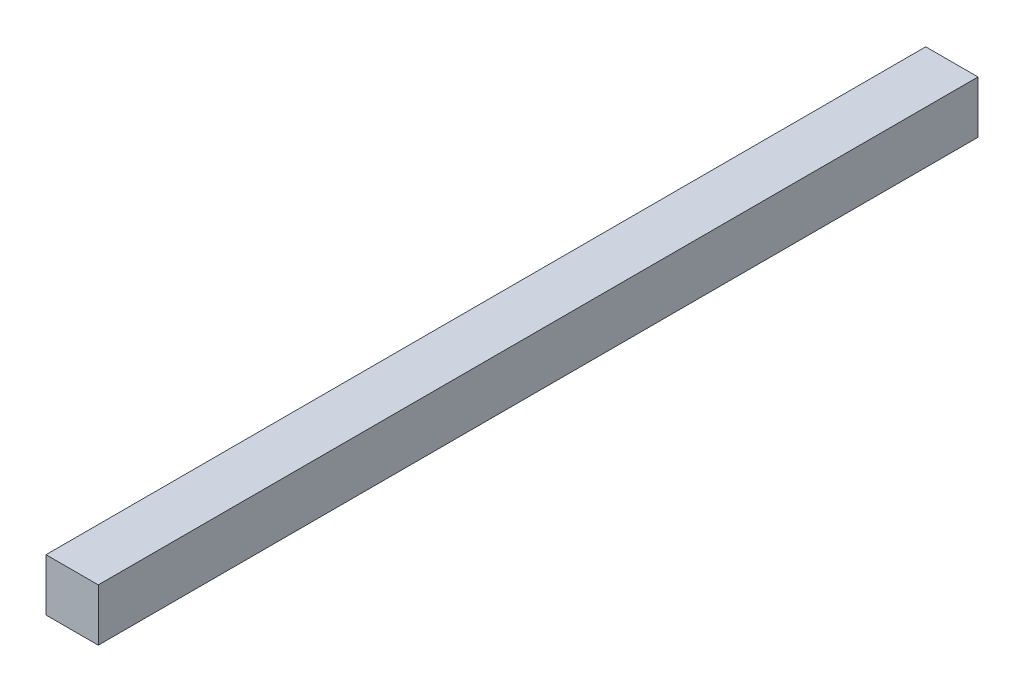
ISO-10303-21;
HEADER;
FILE_DESCRIPTION(('STEP AP214'),'2;1');
FILE_NAME('part.step','',(''),(''),'','','');
FILE_SCHEMA(('AUTOMOTIVE_DESIGN { 1 0 10303 214 1 1 1 1 }'));
ENDSEC;
DATA;
#1=APPLICATION_CONTEXT('core data for automotive mechanical design processes');
#2=APPLICATION_PROTOCOL_DEFINITION('international standard','automotive_design',2000,#1);
#3=PRODUCT_CONTEXT('',#1,'mechanical');
#4=PRODUCT('Part','Part','',(#3));
#5=PRODUCT_RELATED_PRODUCT_CATEGORY('part','',(#4));
#6=PRODUCT_DEFINITION_FORMATION('','',#4);
#7=PRODUCT_DEFINITION_CONTEXT('part definition',#1,'design');
#8=PRODUCT_DEFINITION('design','',#6,#7);
#9=PRODUCT_DEFINITION_SHAPE('','',#8);
#10=(LENGTH_UNIT() NAMED_UNIT(*) SI_UNIT(.MILLI.,.METRE.));
#11=(NAMED_UNIT(*) PLANE_ANGLE_UNIT() SI_UNIT($,.RADIAN.));
#12=(NAMED_UNIT(*) SI_UNIT($,.STERADIAN.) SOLID_ANGLE_UNIT());
#13=UNCERTAINTY_MEASURE_WITH_UNIT(LENGTH_MEASURE(1.E-05),#10,'distance_accuracy_value','');
#14=(GEOMETRIC_REPRESENTATION_CONTEXT(3) GLOBAL_UNCERTAINTY_ASSIGNED_CONTEXT((#13)) GLOBAL_UNIT_ASSIGNED_CONTEXT((#10,
#11,#12)) REPRESENTATION_CONTEXT('',''));
#15=CARTESIAN_POINT('',(0.,0.,0.));
#16=DIRECTION('',(0.,0.,1.));
#17=DIRECTION('',(1.,0.,0.));
#18=AXIS2_PLACEMENT_3D('',#15,#16,#17);
#19=CARTESIAN_POINT('',(6.,6.,202.));
#20=DIRECTION('',(-1.,0.,0.));
#21=DIRECTION('',(0.,-1.,0.));
#22=AXIS2_PLACEMENT_3D('',#19,#20,#21);
#23=PLANE('',#22);
#24=DIRECTION('',(0.,1.,0.));
#25=VECTOR('',#24,1.);
#26=CARTESIAN_POINT('',(6.,6.,0.));
#27=LINE('',#26,#25);
#28=CARTESIAN_POINT('',(6.,-6.,0.));
#29=VERTEX_POINT('',#28);
#30=CARTESIAN_POINT('',(6.,6.,0.));
#31=VERTEX_POINT('',#30);
#32=EDGE_CURVE('E104',#29,#31,#27,.T.);
#33=ORIENTED_EDGE('',*,*,#32,.T.);
#34=DIRECTION('',(0.,0.,-1.));
#35=VECTOR('',#34,1.);
#36=CARTESIAN_POINT('',(6.,6.,202.));
#37=LINE('',#36,#35);
#38=CARTESIAN_POINT('',(6.,6.,202.));
#39=VERTEX_POINT('',#38);
#40=EDGE_CURVE('E11',#39,#31,#37,.T.);
#41=ORIENTED_EDGE('',*,*,#40,.F.);
#42=DIRECTION('',(0.,1.,0.));
#43=VECTOR('',#42,1.);
#44=CARTESIAN_POINT('',(6.,6.,202.));
#45=LINE('',#44,#43);
#46=CARTESIAN_POINT('',(6.,-6.,202.));
#47=VERTEX_POINT('',#46);
#48=EDGE_CURVE('E92',#47,#39,#45,.T.);
#49=ORIENTED_EDGE('',*,*,#48,.F.);
#50=DIRECTION('',(0.,0.,-1.));
#51=VECTOR('',#50,1.);
#52=CARTESIAN_POINT('',(6.,-6.,202.));
#53=LINE('',#52,#51);
#54=EDGE_CURVE('E100',#47,#29,#53,.T.);
#55=ORIENTED_EDGE('',*,*,#54,.T.);
#56=EDGE_LOOP('',(#33,#41,#49,#55));
#57=FACE_BOUND('',#56,.T.);
#58=ADVANCED_FACE('F41',(#57),#23,.F.);
#59=CARTESIAN_POINT('',(-6.,6.,202.));
#60=DIRECTION('',(0.,-1.,0.));
#61=DIRECTION('',(0.,0.,-1.));
#62=AXIS2_PLACEMENT_3D('',#59,#60,#61);
#63=PLANE('',#62);
#64=DIRECTION('',(-1.,0.,0.));
#65=VECTOR('',#64,1.);
#66=CARTESIAN_POINT('',(-6.,6.,0.));
#67=LINE('',#66,#65);
#68=CARTESIAN_POINT('',(-6.,6.,0.));
#69=VERTEX_POINT('',#68);
#70=EDGE_CURVE('E96',#31,#69,#67,.T.);
#71=ORIENTED_EDGE('',*,*,#70,.T.);
#72=DIRECTION('',(0.,0.,-1.));
#73=VECTOR('',#72,1.);
#74=CARTESIAN_POINT('',(-6.,6.,202.));
#75=LINE('',#74,#73);
#76=CARTESIAN_POINT('',(-6.,6.,202.));
#77=VERTEX_POINT('',#76);
#78=EDGE_CURVE('E49',#77,#69,#75,.T.);
#79=ORIENTED_EDGE('',*,*,#78,.F.);
#80=DIRECTION('',(-1.,0.,0.));
#81=VECTOR('',#80,1.);
#82=CARTESIAN_POINT('',(-6.,6.,202.));
#83=LINE('',#82,#81);
#84=EDGE_CURVE('E87',#39,#77,#83,.T.);
#85=ORIENTED_EDGE('',*,*,#84,.F.);
#86=ORIENTED_EDGE('',*,*,#40,.T.);
#87=EDGE_LOOP('',(#71,#79,#85,#86));
#88=FACE_BOUND('',#87,.T.);
#89=ADVANCED_FACE('F95',(#88),#63,.F.);
#90=CARTESIAN_POINT('',(-6.,6.,202.));
#91=DIRECTION('',(1.,0.,0.));
#92=DIRECTION('',(0.,1.,0.));
#93=AXIS2_PLACEMENT_3D('',#90,#91,#92);
#94=PLANE('',#93);
#95=DIRECTION('',(0.,-1.,0.));
#96=VECTOR('',#95,1.);
#97=CARTESIAN_POINT('',(-6.,6.,0.));
#98=LINE('',#97,#96);
#99=CARTESIAN_POINT('',(-6.,-6.,0.));
#100=VERTEX_POINT('',#99);
#101=EDGE_CURVE('E74',#69,#100,#98,.T.);
#102=ORIENTED_EDGE('',*,*,#101,.T.);
#103=DIRECTION('',(0.,0.,-1.));
#104=VECTOR('',#103,1.);
#105=CARTESIAN_POINT('',(-6.,-6.,202.));
#106=LINE('',#105,#104);
#107=CARTESIAN_POINT('',(-6.,-6.,202.));
#108=VERTEX_POINT('',#107);
#109=EDGE_CURVE('E97',#108,#100,#106,.T.);
#110=ORIENTED_EDGE('',*,*,#109,.F.);
#111=DIRECTION('',(0.,-1.,0.));
#112=VECTOR('',#111,1.);
#113=CARTESIAN_POINT('',(-6.,6.,202.));
#114=LINE('',#113,#112);
#115=EDGE_CURVE('E90',#77,#108,#114,.T.);
#116=ORIENTED_EDGE('',*,*,#115,.F.);
#117=ORIENTED_EDGE('',*,*,#78,.T.);
#118=EDGE_LOOP('',(#102,#110,#116,#117));
#119=FACE_BOUND('',#118,.T.);
#120=ADVANCED_FACE('F98',(#119),#94,.F.);
#121=CARTESIAN_POINT('',(-6.,-6.,202.));
#122=DIRECTION('',(0.,1.,0.));
#123=DIRECTION('',(0.,0.,1.));
#124=AXIS2_PLACEMENT_3D('',#121,#122,#123);
#125=PLANE('',#124);
#126=DIRECTION('',(1.,0.,0.));
#127=VECTOR('',#126,1.);
#128=CARTESIAN_POINT('',(-6.,-6.,0.));
#129=LINE('',#128,#127);
#130=EDGE_CURVE('E80',#100,#29,#129,.T.);
#131=ORIENTED_EDGE('',*,*,#130,.T.);
#132=ORIENTED_EDGE('',*,*,#54,.F.);
#133=DIRECTION('',(1.,0.,0.));
#134=VECTOR('',#133,1.);
#135=CARTESIAN_POINT('',(-6.,-6.,202.));
#136=LINE('',#135,#134);
#137=EDGE_CURVE('E57',#108,#47,#136,.T.);
#138=ORIENTED_EDGE('',*,*,#137,.F.);
#139=ORIENTED_EDGE('',*,*,#109,.T.);
#140=EDGE_LOOP('',(#131,#132,#138,#139));
#141=FACE_BOUND('',#140,.T.);
#142=ADVANCED_FACE('F111',(#141),#125,.F.);
#143=CARTESIAN_POINT('',(0.,0.,202.));
#144=DIRECTION('',(0.,0.,1.));
#145=DIRECTION('',(1.,0.,0.));
#146=AXIS2_PLACEMENT_3D('',#143,#144,#145);
#147=PLANE('',#146);
#148=ORIENTED_EDGE('',*,*,#48,.T.);
#149=ORIENTED_EDGE('',*,*,#84,.T.);
#150=ORIENTED_EDGE('',*,*,#115,.T.);
#151=ORIENTED_EDGE('',*,*,#137,.T.);
#152=EDGE_LOOP('',(#148,#149,#150,#151));
#153=FACE_BOUND('',#152,.T.);
#154=ADVANCED_FACE('F88',(#153),#147,.T.);
#155=CARTESIAN_POINT('',(0.,0.,0.));
#156=DIRECTION('',(0.,0.,1.));
#157=DIRECTION('',(1.,0.,0.));
#158=AXIS2_PLACEMENT_3D('',#155,#156,#157);
#159=PLANE('',#158);
#160=ORIENTED_EDGE('',*,*,#32,.F.);
#161=ORIENTED_EDGE('',*,*,#130,.F.);
#162=ORIENTED_EDGE('',*,*,#101,.F.);
#163=ORIENTED_EDGE('',*,*,#70,.F.);
#164=EDGE_LOOP('',(#160,#161,#162,#163));
#165=FACE_BOUND('',#164,.T.);
#166=ADVANCED_FACE('F114',(#165),#159,.F.);
#167=CLOSED_SHELL('',(#58,#89,#120,#142,#154,#166));
#168=MANIFOLD_SOLID_BREP('B2',#167);
#169=ADVANCED_BREP_SHAPE_REPRESENTATION('',(#18,#168),#14);
#170=SHAPE_DEFINITION_REPRESENTATION(#9,#169);
ENDSEC;
END-ISO-10303-21;
